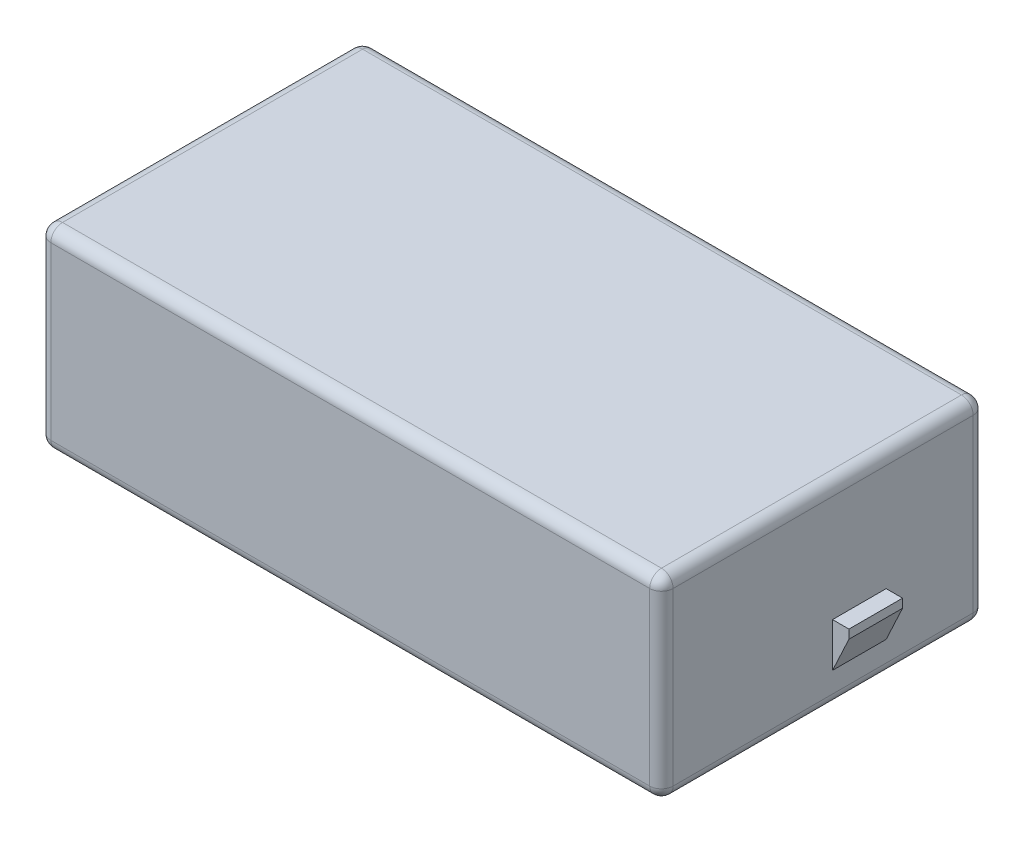
ISO-10303-21;
HEADER;
FILE_DESCRIPTION(('STEP AP214'),'2;1');
FILE_NAME('part.step','',(''),(''),'','','');
FILE_SCHEMA(('AUTOMOTIVE_DESIGN { 1 0 10303 214 1 1 1 1 }'));
ENDSEC;
DATA;
#1=APPLICATION_CONTEXT('core data for automotive mechanical design processes');
#2=APPLICATION_PROTOCOL_DEFINITION('international standard','automotive_design',2000,#1);
#3=PRODUCT_CONTEXT('',#1,'mechanical');
#4=PRODUCT('Part','Part','',(#3));
#5=PRODUCT_RELATED_PRODUCT_CATEGORY('part','',(#4));
#6=PRODUCT_DEFINITION_FORMATION('','',#4);
#7=PRODUCT_DEFINITION_CONTEXT('part definition',#1,'design');
#8=PRODUCT_DEFINITION('design','',#6,#7);
#9=PRODUCT_DEFINITION_SHAPE('','',#8);
#10=(LENGTH_UNIT() NAMED_UNIT(*) SI_UNIT(.MILLI.,.METRE.));
#11=(NAMED_UNIT(*) PLANE_ANGLE_UNIT() SI_UNIT($,.RADIAN.));
#12=(NAMED_UNIT(*) SI_UNIT($,.STERADIAN.) SOLID_ANGLE_UNIT());
#13=UNCERTAINTY_MEASURE_WITH_UNIT(LENGTH_MEASURE(1.E-05),#10,'distance_accuracy_value','');
#14=(GEOMETRIC_REPRESENTATION_CONTEXT(3) GLOBAL_UNCERTAINTY_ASSIGNED_CONTEXT((#13)) GLOBAL_UNIT_ASSIGNED_CONTEXT((#10,
#11,#12)) REPRESENTATION_CONTEXT('',''));
#15=CARTESIAN_POINT('',(0.,0.,0.));
#16=DIRECTION('',(0.,0.,1.));
#17=DIRECTION('',(1.,0.,0.));
#18=AXIS2_PLACEMENT_3D('',#15,#16,#17);
#19=CARTESIAN_POINT('',(0.,0.,0.));
#20=DIRECTION('',(0.,0.,1.));
#21=DIRECTION('',(1.,0.,0.));
#22=AXIS2_PLACEMENT_3D('',#19,#20,#21);
#23=PLANE('',#22);
#24=DIRECTION('',(1.,0.,0.));
#25=VECTOR('',#24,1.);
#26=CARTESIAN_POINT('',(54.9643327067669,25.8667919799499,0.));
#27=LINE('',#26,#25);
#28=CARTESIAN_POINT('',(-49.2356672932331,25.8667919799499,0.));
#29=VERTEX_POINT('',#28);
#30=CARTESIAN_POINT('',(52.9643327067669,25.8667919799499,0.));
#31=VERTEX_POINT('',#30);
#32=EDGE_CURVE('E306',#29,#31,#27,.T.);
#33=ORIENTED_EDGE('',*,*,#32,.T.);
#34=DIRECTION('',(0.,-1.,0.));
#35=VECTOR('',#34,1.);
#36=CARTESIAN_POINT('',(52.9643327067669,-5.33320802005011,0.));
#37=LINE('',#36,#35);
#38=CARTESIAN_POINT('',(52.9643327067669,-3.33320802005011,0.));
#39=VERTEX_POINT('',#38);
#40=EDGE_CURVE('E310',#31,#39,#37,.T.);
#41=ORIENTED_EDGE('',*,*,#40,.T.);
#42=DIRECTION('',(1.,0.,0.));
#43=VECTOR('',#42,1.);
#44=CARTESIAN_POINT('',(0.,-3.33320802005011,0.));
#45=LINE('',#44,#43);
#46=CARTESIAN_POINT('',(-49.2356672932331,-3.33320802005011,0.));
#47=VERTEX_POINT('',#46);
#48=EDGE_CURVE('E308',#39,#47,#45,.F.);
#49=ORIENTED_EDGE('',*,*,#48,.T.);
#50=DIRECTION('',(0.,-1.,0.));
#51=VECTOR('',#50,1.);
#52=CARTESIAN_POINT('',(-49.2356672932331,0.,0.));
#53=LINE('',#52,#51);
#54=EDGE_CURVE('E304',#47,#29,#53,.F.);
#55=ORIENTED_EDGE('',*,*,#54,.T.);
#56=EDGE_LOOP('',(#33,#41,#49,#55));
#57=FACE_BOUND('',#56,.T.);
#58=DIRECTION('',(0.,-1.,0.));
#59=VECTOR('',#58,1.);
#60=CARTESIAN_POINT('',(-19.2356672932331,23.8667919799499,0.));
#61=LINE('',#60,#59);
#62=CARTESIAN_POINT('',(-19.2356672932331,23.8667919799499,0.));
#63=VERTEX_POINT('',#62);
#64=CARTESIAN_POINT('',(-19.2356672932331,7.86679197994989,0.));
#65=VERTEX_POINT('',#64);
#66=EDGE_CURVE('E213',#63,#65,#61,.T.);
#67=ORIENTED_EDGE('',*,*,#66,.F.);
#68=DIRECTION('',(1.,0.,0.));
#69=VECTOR('',#68,1.);
#70=CARTESIAN_POINT('',(-19.2356672932331,23.8667919799499,0.));
#71=LINE('',#70,#69);
#72=CARTESIAN_POINT('',(-44.6356672932331,23.8667919799499,0.));
#73=VERTEX_POINT('',#72);
#74=EDGE_CURVE('E210',#73,#63,#71,.T.);
#75=ORIENTED_EDGE('',*,*,#74,.F.);
#76=DIRECTION('',(0.,1.,0.));
#77=VECTOR('',#76,1.);
#78=CARTESIAN_POINT('',(-44.6356672932331,23.8667919799499,0.));
#79=LINE('',#78,#77);
#80=CARTESIAN_POINT('',(-44.6356672932331,7.86679197994989,0.));
#81=VERTEX_POINT('',#80);
#82=EDGE_CURVE('E53',#81,#73,#79,.T.);
#83=ORIENTED_EDGE('',*,*,#82,.F.);
#84=DIRECTION('',(-1.,0.,0.));
#85=VECTOR('',#84,1.);
#86=CARTESIAN_POINT('',(-19.2356672932331,7.86679197994989,0.));
#87=LINE('',#86,#85);
#88=EDGE_CURVE('E48',#65,#81,#87,.T.);
#89=ORIENTED_EDGE('',*,*,#88,.F.);
#90=EDGE_LOOP('',(#67,#75,#83,#89));
#91=FACE_BOUND('',#90,.T.);
#92=ADVANCED_FACE('F33',(#57,#91),#23,.F.);
#93=CARTESIAN_POINT('',(54.9643327067669,27.8667919799499,55.2));
#94=DIRECTION('',(1.,0.,0.));
#95=DIRECTION('',(0.,1.,0.));
#96=AXIS2_PLACEMENT_3D('',#93,#94,#95);
#97=PLANE('',#96);
#98=DIRECTION('',(0.,0.,-1.));
#99=VECTOR('',#98,1.);
#100=CARTESIAN_POINT('',(54.9643327067669,25.8667919799499,55.2));
#101=LINE('',#100,#99);
#102=CARTESIAN_POINT('',(54.9643327067669,25.8667919799499,2.));
#103=VERTEX_POINT('',#102);
#104=CARTESIAN_POINT('',(54.9643327067669,25.8667919799499,53.2));
#105=VERTEX_POINT('',#104);
#106=EDGE_CURVE('E269',#103,#105,#101,.F.);
#107=ORIENTED_EDGE('',*,*,#106,.T.);
#108=DIRECTION('',(0.,-1.,0.));
#109=VECTOR('',#108,1.);
#110=CARTESIAN_POINT('',(54.9643327067669,27.8667919799499,53.2));
#111=LINE('',#110,#109);
#112=CARTESIAN_POINT('',(54.9643327067669,-3.33320802005011,53.2));
#113=VERTEX_POINT('',#112);
#114=EDGE_CURVE('E274',#105,#113,#111,.T.);
#115=ORIENTED_EDGE('',*,*,#114,.T.);
#116=DIRECTION('',(0.,0.,-1.));
#117=VECTOR('',#116,1.);
#118=CARTESIAN_POINT('',(54.9643327067669,-3.33320802005011,0.));
#119=LINE('',#118,#117);
#120=CARTESIAN_POINT('',(54.9643327067669,-3.33320802005011,2.));
#121=VERTEX_POINT('',#120);
#122=EDGE_CURVE('E272',#113,#121,#119,.T.);
#123=ORIENTED_EDGE('',*,*,#122,.T.);
#124=DIRECTION('',(0.,-1.,0.));
#125=VECTOR('',#124,1.);
#126=CARTESIAN_POINT('',(54.9643327067669,27.8667919799499,2.));
#127=LINE('',#126,#125);
#128=EDGE_CURVE('E267',#121,#103,#127,.F.);
#129=ORIENTED_EDGE('',*,*,#128,.T.);
#130=EDGE_LOOP('',(#107,#115,#123,#129));
#131=FACE_BOUND('',#130,.T.);
#132=DIRECTION('',(0.,0.,-1.));
#133=VECTOR('',#132,1.);
#134=CARTESIAN_POINT('',(54.9643327067669,0.166791979949886,26.));
#135=LINE('',#134,#133);
#136=CARTESIAN_POINT('',(54.9643327067669,0.166791979949886,26.));
#137=VERTEX_POINT('',#136);
#138=CARTESIAN_POINT('',(54.9643327067669,0.166791979949886,16.85));
#139=VERTEX_POINT('',#138);
#140=EDGE_CURVE('E216',#137,#139,#135,.T.);
#141=ORIENTED_EDGE('',*,*,#140,.F.);
#142=DIRECTION('',(0.,-1.,0.));
#143=VECTOR('',#142,1.);
#144=CARTESIAN_POINT('',(54.9643327067669,7.66679197994989,26.));
#145=LINE('',#144,#143);
#146=CARTESIAN_POINT('',(54.9643327067669,7.66679197994989,26.));
#147=VERTEX_POINT('',#146);
#148=EDGE_CURVE('E214',#147,#137,#145,.T.);
#149=ORIENTED_EDGE('',*,*,#148,.F.);
#150=DIRECTION('',(0.,0.,1.));
#151=VECTOR('',#150,1.);
#152=CARTESIAN_POINT('',(54.9643327067669,7.66679197994989,26.));
#153=LINE('',#152,#151);
#154=CARTESIAN_POINT('',(54.9643327067669,7.66679197994988,16.85));
#155=VERTEX_POINT('',#154);
#156=EDGE_CURVE('E226',#155,#147,#153,.T.);
#157=ORIENTED_EDGE('',*,*,#156,.F.);
#158=DIRECTION('',(0.,1.,0.));
#159=VECTOR('',#158,1.);
#160=CARTESIAN_POINT('',(54.9643327067669,7.66679197994989,16.85));
#161=LINE('',#160,#159);
#162=EDGE_CURVE('E233',#139,#155,#161,.T.);
#163=ORIENTED_EDGE('',*,*,#162,.F.);
#164=EDGE_LOOP('',(#141,#149,#157,#163));
#165=FACE_BOUND('',#164,.T.);
#166=ADVANCED_FACE('F406',(#131,#165),#97,.T.);
#167=CARTESIAN_POINT('',(-51.2356672932331,27.8667919799499,55.2));
#168=DIRECTION('',(1.,0.,0.));
#169=DIRECTION('',(0.,1.,0.));
#170=AXIS2_PLACEMENT_3D('',#167,#168,#169);
#171=PLANE('',#170);
#172=DIRECTION('',(0.,0.,-1.));
#173=VECTOR('',#172,1.);
#174=CARTESIAN_POINT('',(-51.2356672932331,25.8667919799499,0.));
#175=LINE('',#174,#173);
#176=CARTESIAN_POINT('',(-51.2356672932331,25.8667919799499,53.2));
#177=VERTEX_POINT('',#176);
#178=CARTESIAN_POINT('',(-51.2356672932331,25.8667919799499,2.));
#179=VERTEX_POINT('',#178);
#180=EDGE_CURVE('E315',#177,#179,#175,.T.);
#181=ORIENTED_EDGE('',*,*,#180,.T.);
#182=DIRECTION('',(0.,-1.,0.));
#183=VECTOR('',#182,1.);
#184=CARTESIAN_POINT('',(-51.2356672932331,27.8667919799499,2.));
#185=LINE('',#184,#183);
#186=CARTESIAN_POINT('',(-51.2356672932331,-3.33320802005011,2.));
#187=VERTEX_POINT('',#186);
#188=EDGE_CURVE('E319',#179,#187,#185,.T.);
#189=ORIENTED_EDGE('',*,*,#188,.T.);
#190=DIRECTION('',(0.,0.,-1.));
#191=VECTOR('',#190,1.);
#192=CARTESIAN_POINT('',(-51.2356672932331,-3.33320802005011,55.2));
#193=LINE('',#192,#191);
#194=CARTESIAN_POINT('',(-51.2356672932331,-3.33320802005011,53.2));
#195=VERTEX_POINT('',#194);
#196=EDGE_CURVE('E317',#187,#195,#193,.F.);
#197=ORIENTED_EDGE('',*,*,#196,.T.);
#198=DIRECTION('',(0.,-1.,0.));
#199=VECTOR('',#198,1.);
#200=CARTESIAN_POINT('',(-51.2356672932331,27.8667919799499,53.2));
#201=LINE('',#200,#199);
#202=EDGE_CURVE('E313',#195,#177,#201,.F.);
#203=ORIENTED_EDGE('',*,*,#202,.T.);
#204=EDGE_LOOP('',(#181,#189,#197,#203));
#205=FACE_BOUND('',#204,.T.);
#206=DIRECTION('',(0.,-1.,0.));
#207=VECTOR('',#206,1.);
#208=CARTESIAN_POINT('',(-51.2356672932331,19.6667919799499,36.));
#209=LINE('',#208,#207);
#210=CARTESIAN_POINT('',(-51.2356672932331,19.6667919799499,36.));
#211=VERTEX_POINT('',#210);
#212=CARTESIAN_POINT('',(-51.2356672932331,6.66679197994988,36.));
#213=VERTEX_POINT('',#212);
#214=EDGE_CURVE('E241',#211,#213,#209,.T.);
#215=ORIENTED_EDGE('',*,*,#214,.F.);
#216=DIRECTION('',(0.,0.,-1.));
#217=VECTOR('',#216,1.);
#218=CARTESIAN_POINT('',(-51.2356672932331,19.6667919799499,36.));
#219=LINE('',#218,#217);
#220=CARTESIAN_POINT('',(-51.2356672932331,19.6667919799499,48.));
#221=VERTEX_POINT('',#220);
#222=EDGE_CURVE('E246',#221,#211,#219,.T.);
#223=ORIENTED_EDGE('',*,*,#222,.F.);
#224=DIRECTION('',(0.,1.,0.));
#225=VECTOR('',#224,1.);
#226=CARTESIAN_POINT('',(-51.2356672932331,19.6667919799499,48.));
#227=LINE('',#226,#225);
#228=CARTESIAN_POINT('',(-51.2356672932331,6.66679197994988,48.));
#229=VERTEX_POINT('',#228);
#230=EDGE_CURVE('E256',#229,#221,#227,.T.);
#231=ORIENTED_EDGE('',*,*,#230,.F.);
#232=DIRECTION('',(0.,0.,1.));
#233=VECTOR('',#232,1.);
#234=CARTESIAN_POINT('',(-51.2356672932331,6.66679197994988,36.));
#235=LINE('',#234,#233);
#236=EDGE_CURVE('E253',#213,#229,#235,.T.);
#237=ORIENTED_EDGE('',*,*,#236,.F.);
#238=EDGE_LOOP('',(#215,#223,#231,#237));
#239=FACE_BOUND('',#238,.T.);
#240=ADVANCED_FACE('F432',(#205,#239),#171,.F.);
#241=CARTESIAN_POINT('',(-51.2356672932331,-5.33320802005011,55.2));
#242=DIRECTION('',(0.,1.,0.));
#243=DIRECTION('',(0.,0.,1.));
#244=AXIS2_PLACEMENT_3D('',#241,#242,#243);
#245=PLANE('',#244);
#246=DIRECTION('',(1.,0.,0.));
#247=VECTOR('',#246,1.);
#248=CARTESIAN_POINT('',(-51.2356672932331,-5.33320802005011,2.));
#249=LINE('',#248,#247);
#250=CARTESIAN_POINT('',(-49.2356672932331,-5.33320802005011,2.));
#251=VERTEX_POINT('',#250);
#252=CARTESIAN_POINT('',(52.9643327067669,-5.33320802005011,2.));
#253=VERTEX_POINT('',#252);
#254=EDGE_CURVE('E290',#251,#253,#249,.T.);
#255=ORIENTED_EDGE('',*,*,#254,.T.);
#256=DIRECTION('',(0.,0.,-1.));
#257=VECTOR('',#256,1.);
#258=CARTESIAN_POINT('',(52.9643327067669,-5.33320802005011,55.2));
#259=LINE('',#258,#257);
#260=CARTESIAN_POINT('',(52.9643327067669,-5.33320802005011,53.2));
#261=VERTEX_POINT('',#260);
#262=EDGE_CURVE('E292',#253,#261,#259,.F.);
#263=ORIENTED_EDGE('',*,*,#262,.T.);
#264=DIRECTION('',(1.,0.,0.));
#265=VECTOR('',#264,1.);
#266=CARTESIAN_POINT('',(-51.2356672932331,-5.33320802005011,53.2));
#267=LINE('',#266,#265);
#268=CARTESIAN_POINT('',(-49.2356672932331,-5.33320802005011,53.2));
#269=VERTEX_POINT('',#268);
#270=EDGE_CURVE('E286',#261,#269,#267,.F.);
#271=ORIENTED_EDGE('',*,*,#270,.T.);
#272=DIRECTION('',(0.,0.,-1.));
#273=VECTOR('',#272,1.);
#274=CARTESIAN_POINT('',(-49.2356672932331,-5.33320802005011,55.2));
#275=LINE('',#274,#273);
#276=EDGE_CURVE('E288',#269,#251,#275,.T.);
#277=ORIENTED_EDGE('',*,*,#276,.T.);
#278=EDGE_LOOP('',(#255,#263,#271,#277));
#279=FACE_BOUND('',#278,.T.);
#280=ADVANCED_FACE('F441',(#279),#245,.F.);
#281=CARTESIAN_POINT('',(-51.2356672932331,27.8667919799499,55.2));
#282=DIRECTION('',(0.,1.,0.));
#283=DIRECTION('',(0.,0.,1.));
#284=AXIS2_PLACEMENT_3D('',#281,#282,#283);
#285=PLANE('',#284);
#286=DIRECTION('',(1.,0.,0.));
#287=VECTOR('',#286,1.);
#288=CARTESIAN_POINT('',(-51.2356672932331,27.8667919799499,53.2));
#289=LINE('',#288,#287);
#290=CARTESIAN_POINT('',(-49.2356672932331,27.8667919799499,53.2));
#291=VERTEX_POINT('',#290);
#292=CARTESIAN_POINT('',(52.9643327067669,27.8667919799499,53.2));
#293=VERTEX_POINT('',#292);
#294=EDGE_CURVE('E295',#291,#293,#289,.T.);
#295=ORIENTED_EDGE('',*,*,#294,.T.);
#296=DIRECTION('',(0.,0.,-1.));
#297=VECTOR('',#296,1.);
#298=CARTESIAN_POINT('',(52.9643327067669,27.8667919799499,55.2));
#299=LINE('',#298,#297);
#300=CARTESIAN_POINT('',(52.9643327067669,27.8667919799499,2.));
#301=VERTEX_POINT('',#300);
#302=EDGE_CURVE('E301',#293,#301,#299,.T.);
#303=ORIENTED_EDGE('',*,*,#302,.T.);
#304=DIRECTION('',(1.,0.,0.));
#305=VECTOR('',#304,1.);
#306=CARTESIAN_POINT('',(-51.2356672932331,27.8667919799499,2.));
#307=LINE('',#306,#305);
#308=CARTESIAN_POINT('',(-49.2356672932331,27.8667919799499,2.));
#309=VERTEX_POINT('',#308);
#310=EDGE_CURVE('E299',#301,#309,#307,.F.);
#311=ORIENTED_EDGE('',*,*,#310,.T.);
#312=DIRECTION('',(0.,0.,-1.));
#313=VECTOR('',#312,1.);
#314=CARTESIAN_POINT('',(-49.2356672932331,27.8667919799499,55.2));
#315=LINE('',#314,#313);
#316=EDGE_CURVE('E297',#309,#291,#315,.F.);
#317=ORIENTED_EDGE('',*,*,#316,.T.);
#318=EDGE_LOOP('',(#295,#303,#311,#317));
#319=FACE_BOUND('',#318,.T.);
#320=ADVANCED_FACE('F439',(#319),#285,.T.);
#321=CARTESIAN_POINT('',(0.,0.,55.2));
#322=DIRECTION('',(0.,0.,1.));
#323=DIRECTION('',(1.,0.,0.));
#324=AXIS2_PLACEMENT_3D('',#321,#322,#323);
#325=PLANE('',#324);
#326=DIRECTION('',(0.,-1.,0.));
#327=VECTOR('',#326,1.);
#328=CARTESIAN_POINT('',(-49.2356672932331,-5.33320802005011,55.2));
#329=LINE('',#328,#327);
#330=CARTESIAN_POINT('',(-49.2356672932331,25.8667919799499,55.2));
#331=VERTEX_POINT('',#330);
#332=CARTESIAN_POINT('',(-49.2356672932331,-3.33320802005011,55.2));
#333=VERTEX_POINT('',#332);
#334=EDGE_CURVE('E279',#331,#333,#329,.T.);
#335=ORIENTED_EDGE('',*,*,#334,.T.);
#336=DIRECTION('',(1.,0.,0.));
#337=VECTOR('',#336,1.);
#338=CARTESIAN_POINT('',(54.9643327067669,-3.33320802005011,55.2));
#339=LINE('',#338,#337);
#340=CARTESIAN_POINT('',(52.9643327067669,-3.33320802005011,55.2));
#341=VERTEX_POINT('',#340);
#342=EDGE_CURVE('E284',#333,#341,#339,.T.);
#343=ORIENTED_EDGE('',*,*,#342,.T.);
#344=DIRECTION('',(0.,-1.,0.));
#345=VECTOR('',#344,1.);
#346=CARTESIAN_POINT('',(52.9643327067669,0.,55.2));
#347=LINE('',#346,#345);
#348=CARTESIAN_POINT('',(52.9643327067669,25.8667919799499,55.2));
#349=VERTEX_POINT('',#348);
#350=EDGE_CURVE('E281',#341,#349,#347,.F.);
#351=ORIENTED_EDGE('',*,*,#350,.T.);
#352=DIRECTION('',(1.,0.,0.));
#353=VECTOR('',#352,1.);
#354=CARTESIAN_POINT('',(0.,25.8667919799499,55.2));
#355=LINE('',#354,#353);
#356=EDGE_CURVE('E277',#349,#331,#355,.F.);
#357=ORIENTED_EDGE('',*,*,#356,.T.);
#358=EDGE_LOOP('',(#335,#343,#351,#357));
#359=FACE_BOUND('',#358,.T.);
#360=ADVANCED_FACE('F437',(#359),#325,.T.);
#361=CARTESIAN_POINT('',(-49.2356672932331,27.8667919799499,2.));
#362=DIRECTION('',(0.,-1.,0.));
#363=DIRECTION('',(1.,0.,0.));
#364=AXIS2_PLACEMENT_3D('',#361,#362,#363);
#365=CYLINDRICAL_SURFACE('',#364,2.);
#366=CARTESIAN_POINT('',(-49.2356672932331,25.8667919799499,2.));
#367=DIRECTION('',(0.,1.,0.));
#368=DIRECTION('',(0.,0.,1.));
#369=AXIS2_PLACEMENT_3D('',#366,#367,#368);
#370=CIRCLE('',#369,2.);
#371=EDGE_CURVE('E270',#29,#179,#370,.T.);
#372=ORIENTED_EDGE('',*,*,#371,.F.);
#373=ORIENTED_EDGE('',*,*,#54,.F.);
#374=CARTESIAN_POINT('',(-49.2356672932331,-3.33320802005011,2.));
#375=DIRECTION('',(0.,-1.,0.));
#376=DIRECTION('',(1.,0.,0.));
#377=AXIS2_PLACEMENT_3D('',#374,#375,#376);
#378=CIRCLE('',#377,2.);
#379=EDGE_CURVE('E383',#187,#47,#378,.T.);
#380=ORIENTED_EDGE('',*,*,#379,.F.);
#381=ORIENTED_EDGE('',*,*,#188,.F.);
#382=EDGE_LOOP('',(#372,#373,#380,#381));
#383=FACE_BOUND('',#382,.T.);
#384=ADVANCED_FACE('F526',(#383),#365,.T.);
#385=CARTESIAN_POINT('',(-49.2356672932331,25.8667919799499,2.));
#386=DIRECTION('',(0.,0.,1.));
#387=DIRECTION('',(1.,0.,0.));
#388=AXIS2_PLACEMENT_3D('',#385,#386,#387);
#389=SPHERICAL_SURFACE('',#388,2.);
#390=CARTESIAN_POINT('',(-49.2356672932331,25.8667919799499,2.));
#391=DIRECTION('',(-1.,0.,0.));
#392=DIRECTION('',(0.,0.,1.));
#393=AXIS2_PLACEMENT_3D('',#390,#391,#392);
#394=CIRCLE('',#393,2.);
#395=EDGE_CURVE('E377',#29,#309,#394,.F.);
#396=ORIENTED_EDGE('',*,*,#395,.F.);
#397=ORIENTED_EDGE('',*,*,#371,.T.);
#398=CARTESIAN_POINT('',(-49.2356672932331,25.8667919799499,2.));
#399=DIRECTION('',(0.,0.,-1.));
#400=DIRECTION('',(0.,1.,0.));
#401=AXIS2_PLACEMENT_3D('',#398,#399,#400);
#402=CIRCLE('',#401,2.);
#403=EDGE_CURVE('E380',#309,#179,#402,.F.);
#404=ORIENTED_EDGE('',*,*,#403,.F.);
#405=EDGE_LOOP('',(#396,#397,#404));
#406=FACE_BOUND('',#405,.T.);
#407=ADVANCED_FACE('F522',(#406),#389,.T.);
#408=CARTESIAN_POINT('',(-49.2356672932331,-3.33320802005011,2.));
#409=DIRECTION('',(0.,0.,1.));
#410=DIRECTION('',(1.,0.,0.));
#411=AXIS2_PLACEMENT_3D('',#408,#409,#410);
#412=SPHERICAL_SURFACE('',#411,2.);
#413=CARTESIAN_POINT('',(-49.2356672932331,-3.33320802005011,2.));
#414=DIRECTION('',(0.,0.,-1.));
#415=DIRECTION('',(-1.,0.,0.));
#416=AXIS2_PLACEMENT_3D('',#413,#414,#415);
#417=CIRCLE('',#416,2.);
#418=EDGE_CURVE('E371',#187,#251,#417,.F.);
#419=ORIENTED_EDGE('',*,*,#418,.F.);
#420=ORIENTED_EDGE('',*,*,#379,.T.);
#421=CARTESIAN_POINT('',(-49.2356672932331,-3.33320802005011,2.));
#422=DIRECTION('',(-1.,0.,0.));
#423=DIRECTION('',(0.,0.,1.));
#424=AXIS2_PLACEMENT_3D('',#421,#422,#423);
#425=CIRCLE('',#424,2.);
#426=EDGE_CURVE('E374',#251,#47,#425,.F.);
#427=ORIENTED_EDGE('',*,*,#426,.F.);
#428=EDGE_LOOP('',(#419,#420,#427));
#429=FACE_BOUND('',#428,.T.);
#430=ADVANCED_FACE('F518',(#429),#412,.T.);
#431=CARTESIAN_POINT('',(-49.2356672932331,25.8667919799499,55.2));
#432=DIRECTION('',(0.,0.,1.));
#433=DIRECTION('',(1.,0.,0.));
#434=AXIS2_PLACEMENT_3D('',#431,#432,#433);
#435=CYLINDRICAL_SURFACE('',#434,2.);
#436=ORIENTED_EDGE('',*,*,#403,.T.);
#437=ORIENTED_EDGE('',*,*,#180,.F.);
#438=CARTESIAN_POINT('',(-49.2356672932331,25.8667919799499,53.2));
#439=DIRECTION('',(0.,0.,1.));
#440=DIRECTION('',(1.,0.,0.));
#441=AXIS2_PLACEMENT_3D('',#438,#439,#440);
#442=CIRCLE('',#441,2.);
#443=EDGE_CURVE('E365',#291,#177,#442,.T.);
#444=ORIENTED_EDGE('',*,*,#443,.F.);
#445=ORIENTED_EDGE('',*,*,#316,.F.);
#446=EDGE_LOOP('',(#436,#437,#444,#445));
#447=FACE_BOUND('',#446,.T.);
#448=ADVANCED_FACE('F514',(#447),#435,.T.);
#449=CARTESIAN_POINT('',(0.,25.8667919799499,2.));
#450=DIRECTION('',(-1.,0.,0.));
#451=DIRECTION('',(0.,0.,1.));
#452=AXIS2_PLACEMENT_3D('',#449,#450,#451);
#453=CYLINDRICAL_SURFACE('',#452,2.);
#454=ORIENTED_EDGE('',*,*,#395,.T.);
#455=ORIENTED_EDGE('',*,*,#310,.F.);
#456=CARTESIAN_POINT('',(52.9643327067669,25.8667919799499,2.));
#457=DIRECTION('',(1.,0.,0.));
#458=DIRECTION('',(0.,0.,-1.));
#459=AXIS2_PLACEMENT_3D('',#456,#457,#458);
#460=CIRCLE('',#459,2.);
#461=EDGE_CURVE('E362',#31,#301,#460,.T.);
#462=ORIENTED_EDGE('',*,*,#461,.F.);
#463=ORIENTED_EDGE('',*,*,#32,.F.);
#464=EDGE_LOOP('',(#454,#455,#462,#463));
#465=FACE_BOUND('',#464,.T.);
#466=ADVANCED_FACE('F510',(#465),#453,.T.);
#467=CARTESIAN_POINT('',(52.9643327067669,0.,2.));
#468=DIRECTION('',(0.,1.,0.));
#469=DIRECTION('',(-1.,0.,0.));
#470=AXIS2_PLACEMENT_3D('',#467,#468,#469);
#471=CYLINDRICAL_SURFACE('',#470,2.);
#472=CARTESIAN_POINT('',(52.9643327067669,-3.33320802005011,2.));
#473=DIRECTION('',(0.,-1.,0.));
#474=DIRECTION('',(1.,0.,0.));
#475=AXIS2_PLACEMENT_3D('',#472,#473,#474);
#476=CIRCLE('',#475,2.);
#477=EDGE_CURVE('E356',#39,#121,#476,.T.);
#478=ORIENTED_EDGE('',*,*,#477,.F.);
#479=ORIENTED_EDGE('',*,*,#40,.F.);
#480=CARTESIAN_POINT('',(52.9643327067669,25.8667919799499,2.));
#481=DIRECTION('',(0.,1.,0.));
#482=DIRECTION('',(0.,0.,1.));
#483=AXIS2_PLACEMENT_3D('',#480,#481,#482);
#484=CIRCLE('',#483,2.);
#485=EDGE_CURVE('E359',#103,#31,#484,.T.);
#486=ORIENTED_EDGE('',*,*,#485,.F.);
#487=ORIENTED_EDGE('',*,*,#128,.F.);
#488=EDGE_LOOP('',(#478,#479,#486,#487));
#489=FACE_BOUND('',#488,.T.);
#490=ADVANCED_FACE('F506',(#489),#471,.T.);
#491=CARTESIAN_POINT('',(-51.2356672932331,-3.33320802005011,2.));
#492=DIRECTION('',(1.,0.,0.));
#493=DIRECTION('',(0.,0.,-1.));
#494=AXIS2_PLACEMENT_3D('',#491,#492,#493);
#495=CYLINDRICAL_SURFACE('',#494,2.);
#496=ORIENTED_EDGE('',*,*,#426,.T.);
#497=ORIENTED_EDGE('',*,*,#48,.F.);
#498=CARTESIAN_POINT('',(52.9643327067669,-3.33320802005011,2.));
#499=DIRECTION('',(1.,0.,0.));
#500=DIRECTION('',(0.,0.,-1.));
#501=AXIS2_PLACEMENT_3D('',#498,#499,#500);
#502=CIRCLE('',#501,2.);
#503=EDGE_CURVE('E354',#253,#39,#502,.T.);
#504=ORIENTED_EDGE('',*,*,#503,.F.);
#505=ORIENTED_EDGE('',*,*,#254,.F.);
#506=EDGE_LOOP('',(#496,#497,#504,#505));
#507=FACE_BOUND('',#506,.T.);
#508=ADVANCED_FACE('F502',(#507),#495,.T.);
#509=CARTESIAN_POINT('',(-49.2356672932331,-3.33320802005011,55.2));
#510=DIRECTION('',(0.,0.,-1.));
#511=DIRECTION('',(-1.,0.,0.));
#512=AXIS2_PLACEMENT_3D('',#509,#510,#511);
#513=CYLINDRICAL_SURFACE('',#512,2.);
#514=ORIENTED_EDGE('',*,*,#418,.T.);
#515=ORIENTED_EDGE('',*,*,#276,.F.);
#516=CARTESIAN_POINT('',(-49.2356672932331,-3.33320802005011,53.2));
#517=DIRECTION('',(0.,0.,1.));
#518=DIRECTION('',(1.,0.,0.));
#519=AXIS2_PLACEMENT_3D('',#516,#517,#518);
#520=CIRCLE('',#519,2.);
#521=EDGE_CURVE('E351',#195,#269,#520,.T.);
#522=ORIENTED_EDGE('',*,*,#521,.F.);
#523=ORIENTED_EDGE('',*,*,#196,.F.);
#524=EDGE_LOOP('',(#514,#515,#522,#523));
#525=FACE_BOUND('',#524,.T.);
#526=ADVANCED_FACE('F498',(#525),#513,.T.);
#527=CARTESIAN_POINT('',(-49.2356672932331,0.,53.2));
#528=DIRECTION('',(0.,1.,0.));
#529=DIRECTION('',(-1.,0.,0.));
#530=AXIS2_PLACEMENT_3D('',#527,#528,#529);
#531=CYLINDRICAL_SURFACE('',#530,2.);
#532=CARTESIAN_POINT('',(-49.2356672932331,25.8667919799499,53.2));
#533=DIRECTION('',(0.,1.,0.));
#534=DIRECTION('',(0.,0.,1.));
#535=AXIS2_PLACEMENT_3D('',#532,#533,#534);
#536=CIRCLE('',#535,2.);
#537=EDGE_CURVE('E368',#177,#331,#536,.T.);
#538=ORIENTED_EDGE('',*,*,#537,.F.);
#539=ORIENTED_EDGE('',*,*,#202,.F.);
#540=CARTESIAN_POINT('',(-49.2356672932331,-3.33320802005011,53.2));
#541=DIRECTION('',(0.,-1.,0.));
#542=DIRECTION('',(1.,0.,0.));
#543=AXIS2_PLACEMENT_3D('',#540,#541,#542);
#544=CIRCLE('',#543,2.);
#545=EDGE_CURVE('E348',#333,#195,#544,.T.);
#546=ORIENTED_EDGE('',*,*,#545,.F.);
#547=ORIENTED_EDGE('',*,*,#334,.F.);
#548=EDGE_LOOP('',(#538,#539,#546,#547));
#549=FACE_BOUND('',#548,.T.);
#550=ADVANCED_FACE('F494',(#549),#531,.T.);
#551=CARTESIAN_POINT('',(-49.2356672932331,25.8667919799499,53.2));
#552=DIRECTION('',(0.,0.,1.));
#553=DIRECTION('',(1.,0.,0.));
#554=AXIS2_PLACEMENT_3D('',#551,#552,#553);
#555=SPHERICAL_SURFACE('',#554,2.);
#556=ORIENTED_EDGE('',*,*,#443,.T.);
#557=ORIENTED_EDGE('',*,*,#537,.T.);
#558=CARTESIAN_POINT('',(-49.2356672932331,25.8667919799499,53.2));
#559=DIRECTION('',(-1.,0.,0.));
#560=DIRECTION('',(0.,0.,1.));
#561=AXIS2_PLACEMENT_3D('',#558,#559,#560);
#562=CIRCLE('',#561,2.);
#563=EDGE_CURVE('E345',#291,#331,#562,.F.);
#564=ORIENTED_EDGE('',*,*,#563,.F.);
#565=EDGE_LOOP('',(#556,#557,#564));
#566=FACE_BOUND('',#565,.T.);
#567=ADVANCED_FACE('F490',(#566),#555,.T.);
#568=CARTESIAN_POINT('',(52.9643327067669,25.8667919799499,2.));
#569=DIRECTION('',(0.,0.,1.));
#570=DIRECTION('',(1.,0.,0.));
#571=AXIS2_PLACEMENT_3D('',#568,#569,#570);
#572=SPHERICAL_SURFACE('',#571,2.);
#573=ORIENTED_EDGE('',*,*,#485,.T.);
#574=ORIENTED_EDGE('',*,*,#461,.T.);
#575=CARTESIAN_POINT('',(52.9643327067669,25.8667919799499,2.));
#576=DIRECTION('',(0.,0.,-1.));
#577=DIRECTION('',(-1.,0.,0.));
#578=AXIS2_PLACEMENT_3D('',#575,#576,#577);
#579=CIRCLE('',#578,2.);
#580=EDGE_CURVE('E343',#103,#301,#579,.F.);
#581=ORIENTED_EDGE('',*,*,#580,.F.);
#582=EDGE_LOOP('',(#573,#574,#581));
#583=FACE_BOUND('',#582,.T.);
#584=ADVANCED_FACE('F486',(#583),#572,.T.);
#585=CARTESIAN_POINT('',(52.9643327067669,-3.33320802005011,2.));
#586=DIRECTION('',(0.,0.,1.));
#587=DIRECTION('',(1.,0.,0.));
#588=AXIS2_PLACEMENT_3D('',#585,#586,#587);
#589=SPHERICAL_SURFACE('',#588,2.);
#590=ORIENTED_EDGE('',*,*,#503,.T.);
#591=ORIENTED_EDGE('',*,*,#477,.T.);
#592=CARTESIAN_POINT('',(52.9643327067669,-3.33320802005011,2.));
#593=DIRECTION('',(0.,0.,-1.));
#594=DIRECTION('',(0.,1.,0.));
#595=AXIS2_PLACEMENT_3D('',#592,#593,#594);
#596=CIRCLE('',#595,2.);
#597=EDGE_CURVE('E340',#253,#121,#596,.F.);
#598=ORIENTED_EDGE('',*,*,#597,.F.);
#599=EDGE_LOOP('',(#590,#591,#598));
#600=FACE_BOUND('',#599,.T.);
#601=ADVANCED_FACE('F482',(#600),#589,.T.);
#602=CARTESIAN_POINT('',(-49.2356672932331,-3.33320802005011,53.2));
#603=DIRECTION('',(0.,0.,1.));
#604=DIRECTION('',(1.,0.,0.));
#605=AXIS2_PLACEMENT_3D('',#602,#603,#604);
#606=SPHERICAL_SURFACE('',#605,2.);
#607=ORIENTED_EDGE('',*,*,#545,.T.);
#608=ORIENTED_EDGE('',*,*,#521,.T.);
#609=CARTESIAN_POINT('',(-49.2356672932331,-3.33320802005011,53.2));
#610=DIRECTION('',(-1.,0.,0.));
#611=DIRECTION('',(0.,0.,1.));
#612=AXIS2_PLACEMENT_3D('',#609,#610,#611);
#613=CIRCLE('',#612,2.);
#614=EDGE_CURVE('E337',#333,#269,#613,.F.);
#615=ORIENTED_EDGE('',*,*,#614,.F.);
#616=EDGE_LOOP('',(#607,#608,#615));
#617=FACE_BOUND('',#616,.T.);
#618=ADVANCED_FACE('F478',(#617),#606,.T.);
#619=CARTESIAN_POINT('',(-51.2356672932331,25.8667919799499,53.2));
#620=DIRECTION('',(1.,0.,0.));
#621=DIRECTION('',(0.,0.,-1.));
#622=AXIS2_PLACEMENT_3D('',#619,#620,#621);
#623=CYLINDRICAL_SURFACE('',#622,2.);
#624=ORIENTED_EDGE('',*,*,#563,.T.);
#625=ORIENTED_EDGE('',*,*,#356,.F.);
#626=CARTESIAN_POINT('',(52.9643327067669,25.8667919799499,53.2));
#627=DIRECTION('',(1.,0.,0.));
#628=DIRECTION('',(0.,0.,-1.));
#629=AXIS2_PLACEMENT_3D('',#626,#627,#628);
#630=CIRCLE('',#629,2.);
#631=EDGE_CURVE('E334',#293,#349,#630,.T.);
#632=ORIENTED_EDGE('',*,*,#631,.F.);
#633=ORIENTED_EDGE('',*,*,#294,.F.);
#634=EDGE_LOOP('',(#624,#625,#632,#633));
#635=FACE_BOUND('',#634,.T.);
#636=ADVANCED_FACE('F474',(#635),#623,.T.);
#637=CARTESIAN_POINT('',(52.9643327067669,25.8667919799499,55.2));
#638=DIRECTION('',(0.,0.,-1.));
#639=DIRECTION('',(-1.,0.,0.));
#640=AXIS2_PLACEMENT_3D('',#637,#638,#639);
#641=CYLINDRICAL_SURFACE('',#640,2.);
#642=ORIENTED_EDGE('',*,*,#580,.T.);
#643=ORIENTED_EDGE('',*,*,#302,.F.);
#644=CARTESIAN_POINT('',(52.9643327067669,25.8667919799499,53.2));
#645=DIRECTION('',(0.,0.,1.));
#646=DIRECTION('',(1.,0.,0.));
#647=AXIS2_PLACEMENT_3D('',#644,#645,#646);
#648=CIRCLE('',#647,2.);
#649=EDGE_CURVE('E331',#105,#293,#648,.T.);
#650=ORIENTED_EDGE('',*,*,#649,.F.);
#651=ORIENTED_EDGE('',*,*,#106,.F.);
#652=EDGE_LOOP('',(#642,#643,#650,#651));
#653=FACE_BOUND('',#652,.T.);
#654=ADVANCED_FACE('F470',(#653),#641,.T.);
#655=CARTESIAN_POINT('',(52.9643327067669,-3.33320802005011,55.2));
#656=DIRECTION('',(0.,0.,1.));
#657=DIRECTION('',(1.,0.,0.));
#658=AXIS2_PLACEMENT_3D('',#655,#656,#657);
#659=CYLINDRICAL_SURFACE('',#658,2.);
#660=ORIENTED_EDGE('',*,*,#597,.T.);
#661=ORIENTED_EDGE('',*,*,#122,.F.);
#662=CARTESIAN_POINT('',(52.9643327067669,-3.33320802005011,53.2));
#663=DIRECTION('',(0.,0.,1.));
#664=DIRECTION('',(1.,0.,0.));
#665=AXIS2_PLACEMENT_3D('',#662,#663,#664);
#666=CIRCLE('',#665,2.);
#667=EDGE_CURVE('E328',#261,#113,#666,.T.);
#668=ORIENTED_EDGE('',*,*,#667,.F.);
#669=ORIENTED_EDGE('',*,*,#262,.F.);
#670=EDGE_LOOP('',(#660,#661,#668,#669));
#671=FACE_BOUND('',#670,.T.);
#672=ADVANCED_FACE('F466',(#671),#659,.T.);
#673=CARTESIAN_POINT('',(0.,-3.33320802005011,53.2));
#674=DIRECTION('',(-1.,0.,0.));
#675=DIRECTION('',(0.,0.,1.));
#676=AXIS2_PLACEMENT_3D('',#673,#674,#675);
#677=CYLINDRICAL_SURFACE('',#676,2.);
#678=ORIENTED_EDGE('',*,*,#614,.T.);
#679=ORIENTED_EDGE('',*,*,#270,.F.);
#680=CARTESIAN_POINT('',(52.9643327067669,-3.33320802005011,53.2));
#681=DIRECTION('',(1.,0.,0.));
#682=DIRECTION('',(0.,0.,-1.));
#683=AXIS2_PLACEMENT_3D('',#680,#681,#682);
#684=CIRCLE('',#683,2.);
#685=EDGE_CURVE('E326',#341,#261,#684,.T.);
#686=ORIENTED_EDGE('',*,*,#685,.F.);
#687=ORIENTED_EDGE('',*,*,#342,.F.);
#688=EDGE_LOOP('',(#678,#679,#686,#687));
#689=FACE_BOUND('',#688,.T.);
#690=ADVANCED_FACE('F462',(#689),#677,.T.);
#691=CARTESIAN_POINT('',(52.9643327067669,25.8667919799499,53.2));
#692=DIRECTION('',(0.,0.,1.));
#693=DIRECTION('',(1.,0.,0.));
#694=AXIS2_PLACEMENT_3D('',#691,#692,#693);
#695=SPHERICAL_SURFACE('',#694,2.);
#696=ORIENTED_EDGE('',*,*,#649,.T.);
#697=ORIENTED_EDGE('',*,*,#631,.T.);
#698=CARTESIAN_POINT('',(52.9643327067669,25.8667919799499,53.2));
#699=DIRECTION('',(0.,1.,0.));
#700=DIRECTION('',(0.,0.,1.));
#701=AXIS2_PLACEMENT_3D('',#698,#699,#700);
#702=CIRCLE('',#701,2.);
#703=EDGE_CURVE('E324',#105,#349,#702,.F.);
#704=ORIENTED_EDGE('',*,*,#703,.F.);
#705=EDGE_LOOP('',(#696,#697,#704));
#706=FACE_BOUND('',#705,.T.);
#707=ADVANCED_FACE('F458',(#706),#695,.T.);
#708=CARTESIAN_POINT('',(52.9643327067669,-3.33320802005011,53.2));
#709=DIRECTION('',(0.,0.,1.));
#710=DIRECTION('',(1.,0.,0.));
#711=AXIS2_PLACEMENT_3D('',#708,#709,#710);
#712=SPHERICAL_SURFACE('',#711,2.);
#713=ORIENTED_EDGE('',*,*,#685,.T.);
#714=ORIENTED_EDGE('',*,*,#667,.T.);
#715=CARTESIAN_POINT('',(52.9643327067669,-3.33320802005011,53.2));
#716=DIRECTION('',(0.,-1.,0.));
#717=DIRECTION('',(0.,0.,-1.));
#718=AXIS2_PLACEMENT_3D('',#715,#716,#717);
#719=CIRCLE('',#718,2.);
#720=EDGE_CURVE('E266',#341,#113,#719,.F.);
#721=ORIENTED_EDGE('',*,*,#720,.F.);
#722=EDGE_LOOP('',(#713,#714,#721));
#723=FACE_BOUND('',#722,.T.);
#724=ADVANCED_FACE('F454',(#723),#712,.T.);
#725=CARTESIAN_POINT('',(52.9643327067669,27.8667919799499,53.2));
#726=DIRECTION('',(0.,-1.,0.));
#727=DIRECTION('',(1.,0.,0.));
#728=AXIS2_PLACEMENT_3D('',#725,#726,#727);
#729=CYLINDRICAL_SURFACE('',#728,2.);
#730=ORIENTED_EDGE('',*,*,#703,.T.);
#731=ORIENTED_EDGE('',*,*,#350,.F.);
#732=ORIENTED_EDGE('',*,*,#720,.T.);
#733=ORIENTED_EDGE('',*,*,#114,.F.);
#734=EDGE_LOOP('',(#730,#731,#732,#733));
#735=FACE_BOUND('',#734,.T.);
#736=ADVANCED_FACE('F450',(#735),#729,.T.);
#737=CARTESIAN_POINT('',(-57.2356672932331,19.6667919799499,36.));
#738=DIRECTION('',(0.,0.,1.));
#739=DIRECTION('',(0.,-1.,0.));
#740=AXIS2_PLACEMENT_3D('',#737,#738,#739);
#741=PLANE('',#740);
#742=ORIENTED_EDGE('',*,*,#214,.T.);
#743=DIRECTION('',(-0.514495755427526,0.857492925712544,0.));
#744=VECTOR('',#743,1.);
#745=CARTESIAN_POINT('',(-57.2356672932331,16.6667919799499,36.));
#746=LINE('',#745,#744);
#747=CARTESIAN_POINT('',(-57.2356672932331,16.6667919799499,36.));
#748=VERTEX_POINT('',#747);
#749=EDGE_CURVE('E392',#213,#748,#746,.T.);
#750=ORIENTED_EDGE('',*,*,#749,.T.);
#751=DIRECTION('',(0.,-1.,0.));
#752=VECTOR('',#751,1.);
#753=CARTESIAN_POINT('',(-57.2356672932331,19.6667919799499,36.));
#754=LINE('',#753,#752);
#755=CARTESIAN_POINT('',(-57.2356672932331,19.6667919799499,36.));
#756=VERTEX_POINT('',#755);
#757=EDGE_CURVE('E242',#756,#748,#754,.T.);
#758=ORIENTED_EDGE('',*,*,#757,.F.);
#759=DIRECTION('',(1.,0.,0.));
#760=VECTOR('',#759,1.);
#761=CARTESIAN_POINT('',(-57.2356672932331,19.6667919799499,36.));
#762=LINE('',#761,#760);
#763=EDGE_CURVE('E250',#756,#211,#762,.T.);
#764=ORIENTED_EDGE('',*,*,#763,.T.);
#765=EDGE_LOOP('',(#742,#750,#758,#764));
#766=FACE_BOUND('',#765,.T.);
#767=ADVANCED_FACE('F453',(#766),#741,.F.);
#768=CARTESIAN_POINT('',(-57.2356672932331,19.6667919799499,48.));
#769=DIRECTION('',(0.,0.,-1.));
#770=DIRECTION('',(-1.,0.,0.));
#771=AXIS2_PLACEMENT_3D('',#768,#769,#770);
#772=PLANE('',#771);
#773=DIRECTION('',(0.,1.,0.));
#774=VECTOR('',#773,1.);
#775=CARTESIAN_POINT('',(-57.2356672932331,19.6667919799499,48.));
#776=LINE('',#775,#774);
#777=CARTESIAN_POINT('',(-57.2356672932331,16.6667919799499,48.));
#778=VERTEX_POINT('',#777);
#779=CARTESIAN_POINT('',(-57.2356672932331,19.6667919799499,48.));
#780=VERTEX_POINT('',#779);
#781=EDGE_CURVE('E245',#778,#780,#776,.T.);
#782=ORIENTED_EDGE('',*,*,#781,.F.);
#783=DIRECTION('',(0.514495755427526,-0.857492925712544,0.));
#784=VECTOR('',#783,1.);
#785=CARTESIAN_POINT('',(-57.2356672932331,16.6667919799499,48.));
#786=LINE('',#785,#784);
#787=EDGE_CURVE('E390',#778,#229,#786,.T.);
#788=ORIENTED_EDGE('',*,*,#787,.T.);
#789=ORIENTED_EDGE('',*,*,#230,.T.);
#790=DIRECTION('',(1.,0.,0.));
#791=VECTOR('',#790,1.);
#792=CARTESIAN_POINT('',(-57.2356672932331,19.6667919799499,48.));
#793=LINE('',#792,#791);
#794=EDGE_CURVE('E263',#780,#221,#793,.T.);
#795=ORIENTED_EDGE('',*,*,#794,.F.);
#796=EDGE_LOOP('',(#782,#788,#789,#795));
#797=FACE_BOUND('',#796,.T.);
#798=ADVANCED_FACE('F554',(#797),#772,.F.);
#799=CARTESIAN_POINT('',(-57.2356672932331,19.6667919799499,36.));
#800=DIRECTION('',(0.,-1.,0.));
#801=DIRECTION('',(1.,0.,0.));
#802=AXIS2_PLACEMENT_3D('',#799,#800,#801);
#803=PLANE('',#802);
#804=ORIENTED_EDGE('',*,*,#222,.T.);
#805=ORIENTED_EDGE('',*,*,#763,.F.);
#806=DIRECTION('',(0.,0.,-1.));
#807=VECTOR('',#806,1.);
#808=CARTESIAN_POINT('',(-57.2356672932331,19.6667919799499,36.));
#809=LINE('',#808,#807);
#810=EDGE_CURVE('E248',#780,#756,#809,.T.);
#811=ORIENTED_EDGE('',*,*,#810,.F.);
#812=ORIENTED_EDGE('',*,*,#794,.T.);
#813=EDGE_LOOP('',(#804,#805,#811,#812));
#814=FACE_BOUND('',#813,.T.);
#815=ADVANCED_FACE('F539',(#814),#803,.F.);
#816=CARTESIAN_POINT('',(-57.2356672932331,0.,0.));
#817=DIRECTION('',(-1.,0.,0.));
#818=DIRECTION('',(0.,-1.,0.));
#819=AXIS2_PLACEMENT_3D('',#816,#817,#818);
#820=PLANE('',#819);
#821=ORIENTED_EDGE('',*,*,#757,.T.);
#822=DIRECTION('',(0.,0.,1.));
#823=VECTOR('',#822,1.);
#824=CARTESIAN_POINT('',(-57.2356672932331,16.6667919799499,48.));
#825=LINE('',#824,#823);
#826=EDGE_CURVE('E322',#748,#778,#825,.T.);
#827=ORIENTED_EDGE('',*,*,#826,.T.);
#828=ORIENTED_EDGE('',*,*,#781,.T.);
#829=ORIENTED_EDGE('',*,*,#810,.T.);
#830=EDGE_LOOP('',(#821,#827,#828,#829));
#831=FACE_BOUND('',#830,.T.);
#832=ADVANCED_FACE('F532',(#831),#820,.T.);
#833=CARTESIAN_POINT('',(-57.2356672932331,16.6667919799499,0.));
#834=DIRECTION('',(-0.857492925712544,-0.514495755427526,0.));
#835=DIRECTION('',(0.,0.,-1.));
#836=AXIS2_PLACEMENT_3D('',#833,#834,#835);
#837=PLANE('',#836);
#838=ORIENTED_EDGE('',*,*,#749,.F.);
#839=ORIENTED_EDGE('',*,*,#236,.T.);
#840=ORIENTED_EDGE('',*,*,#787,.F.);
#841=ORIENTED_EDGE('',*,*,#826,.F.);
#842=EDGE_LOOP('',(#838,#839,#840,#841));
#843=FACE_BOUND('',#842,.T.);
#844=ADVANCED_FACE('F530',(#843),#837,.T.);
#845=CARTESIAN_POINT('',(57.7643327067669,7.66679197994989,26.));
#846=DIRECTION('',(0.,0.,-1.));
#847=DIRECTION('',(-1.,0.,0.));
#848=AXIS2_PLACEMENT_3D('',#845,#846,#847);
#849=PLANE('',#848);
#850=ORIENTED_EDGE('',*,*,#148,.T.);
#851=DIRECTION('',(0.422885465331122,0.906183139995267,0.));
#852=VECTOR('',#851,1.);
#853=CARTESIAN_POINT('',(57.7643327067669,6.16679197994996,26.));
#854=LINE('',#853,#852);
#855=CARTESIAN_POINT('',(57.7643327067669,6.16679197994996,26.));
#856=VERTEX_POINT('',#855);
#857=EDGE_CURVE('E11',#137,#856,#854,.T.);
#858=ORIENTED_EDGE('',*,*,#857,.T.);
#859=DIRECTION('',(0.,-1.,0.));
#860=VECTOR('',#859,1.);
#861=CARTESIAN_POINT('',(57.7643327067669,7.66679197994989,26.));
#862=LINE('',#861,#860);
#863=CARTESIAN_POINT('',(57.7643327067669,7.66679197994989,26.));
#864=VERTEX_POINT('',#863);
#865=EDGE_CURVE('E222',#864,#856,#862,.T.);
#866=ORIENTED_EDGE('',*,*,#865,.F.);
#867=DIRECTION('',(-1.,0.,0.));
#868=VECTOR('',#867,1.);
#869=CARTESIAN_POINT('',(57.7643327067669,7.66679197994989,26.));
#870=LINE('',#869,#868);
#871=EDGE_CURVE('E229',#864,#147,#870,.T.);
#872=ORIENTED_EDGE('',*,*,#871,.T.);
#873=EDGE_LOOP('',(#850,#858,#866,#872));
#874=FACE_BOUND('',#873,.T.);
#875=ADVANCED_FACE('F411',(#874),#849,.F.);
#876=CARTESIAN_POINT('',(57.7643327067669,7.66679197994989,16.85));
#877=DIRECTION('',(0.,0.,1.));
#878=DIRECTION('',(1.,0.,0.));
#879=AXIS2_PLACEMENT_3D('',#876,#877,#878);
#880=PLANE('',#879);
#881=DIRECTION('',(0.,1.,0.));
#882=VECTOR('',#881,1.);
#883=CARTESIAN_POINT('',(57.7643327067669,7.66679197994989,16.85));
#884=LINE('',#883,#882);
#885=CARTESIAN_POINT('',(57.7643327067669,6.16679197994996,16.85));
#886=VERTEX_POINT('',#885);
#887=CARTESIAN_POINT('',(57.7643327067669,7.66679197994989,16.85));
#888=VERTEX_POINT('',#887);
#889=EDGE_CURVE('E225',#886,#888,#884,.T.);
#890=ORIENTED_EDGE('',*,*,#889,.F.);
#891=DIRECTION('',(-0.422885465331122,-0.906183139995267,0.));
#892=VECTOR('',#891,1.);
#893=CARTESIAN_POINT('',(57.7643327067669,6.16679197994996,16.85));
#894=LINE('',#893,#892);
#895=EDGE_CURVE('E41',#886,#139,#894,.T.);
#896=ORIENTED_EDGE('',*,*,#895,.T.);
#897=ORIENTED_EDGE('',*,*,#162,.T.);
#898=DIRECTION('',(-1.,0.,0.));
#899=VECTOR('',#898,1.);
#900=CARTESIAN_POINT('',(57.7643327067669,7.66679197994989,16.85));
#901=LINE('',#900,#899);
#902=EDGE_CURVE('E239',#888,#155,#901,.T.);
#903=ORIENTED_EDGE('',*,*,#902,.F.);
#904=EDGE_LOOP('',(#890,#896,#897,#903));
#905=FACE_BOUND('',#904,.T.);
#906=ADVANCED_FACE('F399',(#905),#880,.F.);
#907=CARTESIAN_POINT('',(57.7643327067669,7.66679197994989,26.));
#908=DIRECTION('',(0.,-1.,0.));
#909=DIRECTION('',(1.,0.,0.));
#910=AXIS2_PLACEMENT_3D('',#907,#908,#909);
#911=PLANE('',#910);
#912=ORIENTED_EDGE('',*,*,#156,.T.);
#913=ORIENTED_EDGE('',*,*,#871,.F.);
#914=DIRECTION('',(0.,0.,1.));
#915=VECTOR('',#914,1.);
#916=CARTESIAN_POINT('',(57.7643327067669,7.66679197994989,26.));
#917=LINE('',#916,#915);
#918=EDGE_CURVE('E228',#888,#864,#917,.T.);
#919=ORIENTED_EDGE('',*,*,#918,.F.);
#920=ORIENTED_EDGE('',*,*,#902,.T.);
#921=EDGE_LOOP('',(#912,#913,#919,#920));
#922=FACE_BOUND('',#921,.T.);
#923=ADVANCED_FACE('F417',(#922),#911,.F.);
#924=CARTESIAN_POINT('',(57.7643327067669,0.,0.));
#925=DIRECTION('',(1.,0.,0.));
#926=DIRECTION('',(0.,0.,-1.));
#927=AXIS2_PLACEMENT_3D('',#924,#925,#926);
#928=PLANE('',#927);
#929=ORIENTED_EDGE('',*,*,#865,.T.);
#930=DIRECTION('',(0.,0.,-1.));
#931=VECTOR('',#930,1.);
#932=CARTESIAN_POINT('',(57.7643327067669,6.16679197994996,16.85));
#933=LINE('',#932,#931);
#934=EDGE_CURVE('E394',#856,#886,#933,.T.);
#935=ORIENTED_EDGE('',*,*,#934,.T.);
#936=ORIENTED_EDGE('',*,*,#889,.T.);
#937=ORIENTED_EDGE('',*,*,#918,.T.);
#938=EDGE_LOOP('',(#929,#935,#936,#937));
#939=FACE_BOUND('',#938,.T.);
#940=ADVANCED_FACE('F413',(#939),#928,.T.);
#941=CARTESIAN_POINT('',(57.7643327067669,6.16679197994996,0.));
#942=DIRECTION('',(0.906183139995266,-0.422885465331122,0.));
#943=DIRECTION('',(0.,0.,1.));
#944=AXIS2_PLACEMENT_3D('',#941,#942,#943);
#945=PLANE('',#944);
#946=ORIENTED_EDGE('',*,*,#857,.F.);
#947=ORIENTED_EDGE('',*,*,#140,.T.);
#948=ORIENTED_EDGE('',*,*,#895,.F.);
#949=ORIENTED_EDGE('',*,*,#934,.F.);
#950=EDGE_LOOP('',(#946,#947,#948,#949));
#951=FACE_BOUND('',#950,.T.);
#952=ADVANCED_FACE('F35',(#951),#945,.T.);
#953=CARTESIAN_POINT('',(-19.2356672932331,23.8667919799499,-2.5));
#954=DIRECTION('',(-1.,0.,0.));
#955=DIRECTION('',(0.,-1.,0.));
#956=AXIS2_PLACEMENT_3D('',#953,#954,#955);
#957=PLANE('',#956);
#958=ORIENTED_EDGE('',*,*,#66,.T.);
#959=DIRECTION('',(0.,0.,1.));
#960=VECTOR('',#959,1.);
#961=CARTESIAN_POINT('',(-19.2356672932331,7.86679197994989,-2.5));
#962=LINE('',#961,#960);
#963=CARTESIAN_POINT('',(-19.2356672932331,7.86679197994989,-2.5));
#964=VERTEX_POINT('',#963);
#965=EDGE_CURVE('E194',#964,#65,#962,.T.);
#966=ORIENTED_EDGE('',*,*,#965,.F.);
#967=DIRECTION('',(0.,-1.,0.));
#968=VECTOR('',#967,1.);
#969=CARTESIAN_POINT('',(-19.2356672932331,23.8667919799499,-2.5));
#970=LINE('',#969,#968);
#971=CARTESIAN_POINT('',(-19.2356672932331,23.8667919799499,-2.5));
#972=VERTEX_POINT('',#971);
#973=EDGE_CURVE('E201',#972,#964,#970,.T.);
#974=ORIENTED_EDGE('',*,*,#973,.F.);
#975=DIRECTION('',(0.,0.,1.));
#976=VECTOR('',#975,1.);
#977=CARTESIAN_POINT('',(-19.2356672932331,23.8667919799499,-2.5));
#978=LINE('',#977,#976);
#979=EDGE_CURVE('E749',#972,#63,#978,.T.);
#980=ORIENTED_EDGE('',*,*,#979,.T.);
#981=EDGE_LOOP('',(#958,#966,#974,#980));
#982=FACE_BOUND('',#981,.T.);
#983=ADVANCED_FACE('F212',(#982),#957,.F.);
#984=CARTESIAN_POINT('',(-19.2356672932331,7.86679197994989,-2.5));
#985=DIRECTION('',(0.,1.,0.));
#986=DIRECTION('',(0.,0.,1.));
#987=AXIS2_PLACEMENT_3D('',#984,#985,#986);
#988=PLANE('',#987);
#989=ORIENTED_EDGE('',*,*,#88,.T.);
#990=DIRECTION('',(0.,0.,1.));
#991=VECTOR('',#990,1.);
#992=CARTESIAN_POINT('',(-44.6356672932331,7.86679197994989,-2.5));
#993=LINE('',#992,#991);
#994=CARTESIAN_POINT('',(-44.6356672932331,7.86679197994989,-2.5));
#995=VERTEX_POINT('',#994);
#996=EDGE_CURVE('E197',#995,#81,#993,.T.);
#997=ORIENTED_EDGE('',*,*,#996,.F.);
#998=DIRECTION('',(-1.,0.,0.));
#999=VECTOR('',#998,1.);
#1000=CARTESIAN_POINT('',(-19.2356672932331,7.86679197994989,-2.5));
#1001=LINE('',#1000,#999);
#1002=EDGE_CURVE('E190',#964,#995,#1001,.T.);
#1003=ORIENTED_EDGE('',*,*,#1002,.F.);
#1004=ORIENTED_EDGE('',*,*,#965,.T.);
#1005=EDGE_LOOP('',(#989,#997,#1003,#1004));
#1006=FACE_BOUND('',#1005,.T.);
#1007=ADVANCED_FACE('F192',(#1006),#988,.F.);
#1008=CARTESIAN_POINT('',(-44.6356672932331,23.8667919799499,-2.5));
#1009=DIRECTION('',(1.,0.,0.));
#1010=DIRECTION('',(0.,1.,0.));
#1011=AXIS2_PLACEMENT_3D('',#1008,#1009,#1010);
#1012=PLANE('',#1011);
#1013=ORIENTED_EDGE('',*,*,#82,.T.);
#1014=DIRECTION('',(0.,0.,1.));
#1015=VECTOR('',#1014,1.);
#1016=CARTESIAN_POINT('',(-44.6356672932331,23.8667919799499,-2.5));
#1017=LINE('',#1016,#1015);
#1018=CARTESIAN_POINT('',(-44.6356672932331,23.8667919799499,-2.5));
#1019=VERTEX_POINT('',#1018);
#1020=EDGE_CURVE('E218',#1019,#73,#1017,.T.);
#1021=ORIENTED_EDGE('',*,*,#1020,.F.);
#1022=DIRECTION('',(0.,1.,0.));
#1023=VECTOR('',#1022,1.);
#1024=CARTESIAN_POINT('',(-44.6356672932331,23.8667919799499,-2.5));
#1025=LINE('',#1024,#1023);
#1026=EDGE_CURVE('E200',#995,#1019,#1025,.T.);
#1027=ORIENTED_EDGE('',*,*,#1026,.F.);
#1028=ORIENTED_EDGE('',*,*,#996,.T.);
#1029=EDGE_LOOP('',(#1013,#1021,#1027,#1028));
#1030=FACE_BOUND('',#1029,.T.);
#1031=ADVANCED_FACE('F716',(#1030),#1012,.F.);
#1032=CARTESIAN_POINT('',(-19.2356672932331,23.8667919799499,-2.5));
#1033=DIRECTION('',(0.,-1.,0.));
#1034=DIRECTION('',(1.,0.,0.));
#1035=AXIS2_PLACEMENT_3D('',#1032,#1033,#1034);
#1036=PLANE('',#1035);
#1037=ORIENTED_EDGE('',*,*,#74,.T.);
#1038=ORIENTED_EDGE('',*,*,#979,.F.);
#1039=DIRECTION('',(1.,0.,0.));
#1040=VECTOR('',#1039,1.);
#1041=CARTESIAN_POINT('',(-19.2356672932331,23.8667919799499,-2.5));
#1042=LINE('',#1041,#1040);
#1043=EDGE_CURVE('E206',#1019,#972,#1042,.T.);
#1044=ORIENTED_EDGE('',*,*,#1043,.F.);
#1045=ORIENTED_EDGE('',*,*,#1020,.T.);
#1046=EDGE_LOOP('',(#1037,#1038,#1044,#1045));
#1047=FACE_BOUND('',#1046,.T.);
#1048=ADVANCED_FACE('F725',(#1047),#1036,.F.);
#1049=CARTESIAN_POINT('',(0.,0.,-2.5));
#1050=DIRECTION('',(0.,0.,-1.));
#1051=DIRECTION('',(-1.,0.,0.));
#1052=AXIS2_PLACEMENT_3D('',#1049,#1050,#1051);
#1053=PLANE('',#1052);
#1054=ORIENTED_EDGE('',*,*,#973,.T.);
#1055=ORIENTED_EDGE('',*,*,#1002,.T.);
#1056=ORIENTED_EDGE('',*,*,#1026,.T.);
#1057=ORIENTED_EDGE('',*,*,#1043,.T.);
#1058=EDGE_LOOP('',(#1054,#1055,#1056,#1057));
#1059=FACE_BOUND('',#1058,.T.);
#1060=ADVANCED_FACE('F204',(#1059),#1053,.T.);
#1061=CLOSED_SHELL('',(#92,#166,#240,#280,#320,#360,#384,#407,#430,#448,#466,#490,#508,#526,
#550,#567,#584,#601,#618,#636,#654,#672,#690,#707,#724,#736,#767,#798,#815,#832,#844,#875,#906,
#923,#940,#952,#983,#1007,#1031,#1048,#1060));
#1062=MANIFOLD_SOLID_BREP('B2',#1061);
#1063=ADVANCED_BREP_SHAPE_REPRESENTATION('',(#18,#1062),#14);
#1064=SHAPE_DEFINITION_REPRESENTATION(#9,#1063);
ENDSEC;
END-ISO-10303-21;
